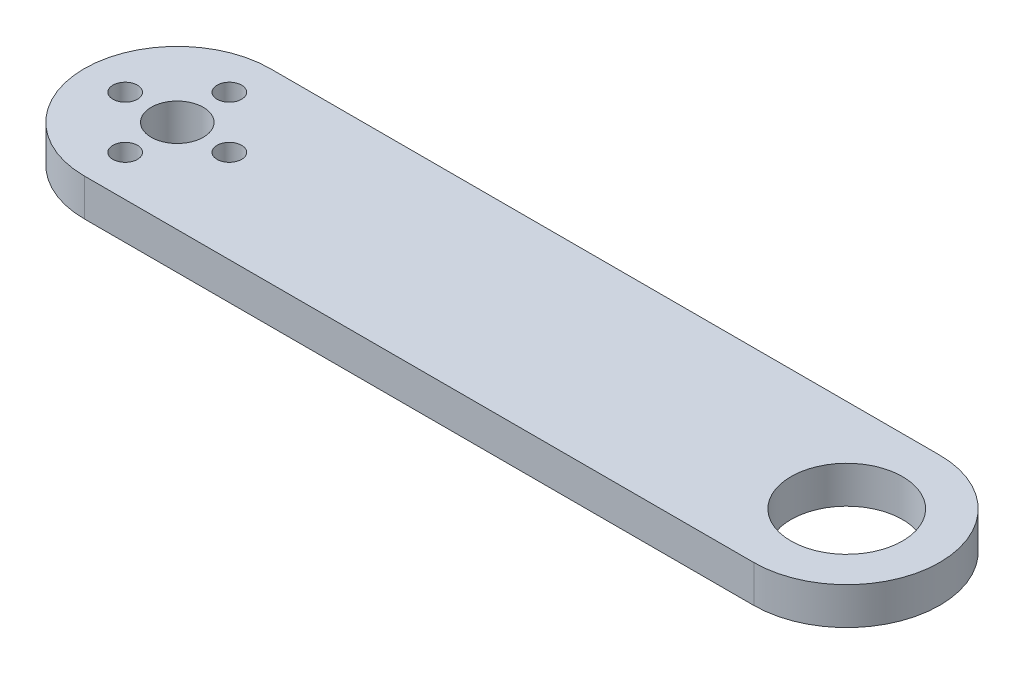
ISO-10303-21;
HEADER;
FILE_DESCRIPTION(('STEP AP214'),'2;1');
FILE_NAME('part.step','',(''),(''),'','','');
FILE_SCHEMA(('AUTOMOTIVE_DESIGN { 1 0 10303 214 1 1 1 1 }'));
ENDSEC;
DATA;
#1=APPLICATION_CONTEXT('core data for automotive mechanical design processes');
#2=APPLICATION_PROTOCOL_DEFINITION('international standard','automotive_design',2000,#1);
#3=PRODUCT_CONTEXT('',#1,'mechanical');
#4=PRODUCT('Part','Part','',(#3));
#5=PRODUCT_RELATED_PRODUCT_CATEGORY('part','',(#4));
#6=PRODUCT_DEFINITION_FORMATION('','',#4);
#7=PRODUCT_DEFINITION_CONTEXT('part definition',#1,'design');
#8=PRODUCT_DEFINITION('design','',#6,#7);
#9=PRODUCT_DEFINITION_SHAPE('','',#8);
#10=(LENGTH_UNIT() NAMED_UNIT(*) SI_UNIT(.MILLI.,.METRE.));
#11=(NAMED_UNIT(*) PLANE_ANGLE_UNIT() SI_UNIT($,.RADIAN.));
#12=(NAMED_UNIT(*) SI_UNIT($,.STERADIAN.) SOLID_ANGLE_UNIT());
#13=UNCERTAINTY_MEASURE_WITH_UNIT(LENGTH_MEASURE(1.E-05),#10,'distance_accuracy_value','');
#14=(GEOMETRIC_REPRESENTATION_CONTEXT(3) GLOBAL_UNCERTAINTY_ASSIGNED_CONTEXT((#13)) GLOBAL_UNIT_ASSIGNED_CONTEXT((#10,
#11,#12)) REPRESENTATION_CONTEXT('',''));
#15=CARTESIAN_POINT('',(0.,0.,0.));
#16=DIRECTION('',(0.,0.,1.));
#17=DIRECTION('',(1.,0.,0.));
#18=AXIS2_PLACEMENT_3D('',#15,#16,#17);
#19=CARTESIAN_POINT('',(45.,5.,0.));
#20=DIRECTION('',(0.,-1.,0.));
#21=DIRECTION('',(0.,0.,-1.));
#22=AXIS2_PLACEMENT_3D('',#19,#20,#21);
#23=CYLINDRICAL_SURFACE('',#22,12.5);
#24=CARTESIAN_POINT('',(45.,0.,0.));
#25=DIRECTION('',(0.,1.,0.));
#26=DIRECTION('',(0.,0.,1.));
#27=AXIS2_PLACEMENT_3D('',#24,#25,#26);
#28=CIRCLE('',#27,12.5);
#29=CARTESIAN_POINT('',(45.,0.,12.5));
#30=VERTEX_POINT('',#29);
#31=CARTESIAN_POINT('',(45.,0.,-12.5));
#32=VERTEX_POINT('',#31);
#33=EDGE_CURVE('E98',#30,#32,#28,.T.);
#34=ORIENTED_EDGE('',*,*,#33,.T.);
#35=DIRECTION('',(0.,-1.,0.));
#36=VECTOR('',#35,1.);
#37=CARTESIAN_POINT('',(45.,5.,-12.5));
#38=LINE('',#37,#36);
#39=CARTESIAN_POINT('',(45.,5.,-12.5));
#40=VERTEX_POINT('',#39);
#41=EDGE_CURVE('E11',#40,#32,#38,.T.);
#42=ORIENTED_EDGE('',*,*,#41,.F.);
#43=CARTESIAN_POINT('',(45.,5.,0.));
#44=DIRECTION('',(0.,1.,0.));
#45=DIRECTION('',(0.,0.,1.));
#46=AXIS2_PLACEMENT_3D('',#43,#44,#45);
#47=CIRCLE('',#46,12.5);
#48=CARTESIAN_POINT('',(45.,5.,12.5));
#49=VERTEX_POINT('',#48);
#50=EDGE_CURVE('E86',#49,#40,#47,.T.);
#51=ORIENTED_EDGE('',*,*,#50,.F.);
#52=DIRECTION('',(0.,-1.,0.));
#53=VECTOR('',#52,1.);
#54=CARTESIAN_POINT('',(45.,5.,12.5));
#55=LINE('',#54,#53);
#56=EDGE_CURVE('E94',#49,#30,#55,.T.);
#57=ORIENTED_EDGE('',*,*,#56,.T.);
#58=EDGE_LOOP('',(#34,#42,#51,#57));
#59=FACE_BOUND('',#58,.T.);
#60=ADVANCED_FACE('F35',(#59),#23,.T.);
#61=CARTESIAN_POINT('',(45.,5.,-12.5));
#62=DIRECTION('',(0.,0.,1.));
#63=DIRECTION('',(1.,0.,0.));
#64=AXIS2_PLACEMENT_3D('',#61,#62,#63);
#65=PLANE('',#64);
#66=DIRECTION('',(-1.,0.,0.));
#67=VECTOR('',#66,1.);
#68=CARTESIAN_POINT('',(45.,0.,-12.5));
#69=LINE('',#68,#67);
#70=CARTESIAN_POINT('',(-45.,0.,-12.5));
#71=VERTEX_POINT('',#70);
#72=EDGE_CURVE('E90',#32,#71,#69,.T.);
#73=ORIENTED_EDGE('',*,*,#72,.T.);
#74=DIRECTION('',(0.,-1.,0.));
#75=VECTOR('',#74,1.);
#76=CARTESIAN_POINT('',(-45.,5.,-12.5));
#77=LINE('',#76,#75);
#78=CARTESIAN_POINT('',(-45.,5.,-12.5));
#79=VERTEX_POINT('',#78);
#80=EDGE_CURVE('E43',#79,#71,#77,.T.);
#81=ORIENTED_EDGE('',*,*,#80,.F.);
#82=DIRECTION('',(-1.,0.,0.));
#83=VECTOR('',#82,1.);
#84=CARTESIAN_POINT('',(45.,5.,-12.5));
#85=LINE('',#84,#83);
#86=EDGE_CURVE('E81',#40,#79,#85,.T.);
#87=ORIENTED_EDGE('',*,*,#86,.F.);
#88=ORIENTED_EDGE('',*,*,#41,.T.);
#89=EDGE_LOOP('',(#73,#81,#87,#88));
#90=FACE_BOUND('',#89,.T.);
#91=ADVANCED_FACE('F89',(#90),#65,.F.);
#92=CARTESIAN_POINT('',(-45.,5.,0.));
#93=DIRECTION('',(0.,-1.,0.));
#94=DIRECTION('',(0.,0.,-1.));
#95=AXIS2_PLACEMENT_3D('',#92,#93,#94);
#96=CYLINDRICAL_SURFACE('',#95,12.5);
#97=CARTESIAN_POINT('',(-45.,0.,0.));
#98=DIRECTION('',(0.,1.,0.));
#99=DIRECTION('',(0.,0.,1.));
#100=AXIS2_PLACEMENT_3D('',#97,#98,#99);
#101=CIRCLE('',#100,12.5);
#102=CARTESIAN_POINT('',(-45.,0.,12.5));
#103=VERTEX_POINT('',#102);
#104=EDGE_CURVE('E68',#71,#103,#101,.T.);
#105=ORIENTED_EDGE('',*,*,#104,.T.);
#106=DIRECTION('',(0.,-1.,0.));
#107=VECTOR('',#106,1.);
#108=CARTESIAN_POINT('',(-45.,5.,12.5));
#109=LINE('',#108,#107);
#110=CARTESIAN_POINT('',(-45.,5.,12.5));
#111=VERTEX_POINT('',#110);
#112=EDGE_CURVE('E91',#111,#103,#109,.T.);
#113=ORIENTED_EDGE('',*,*,#112,.F.);
#114=CARTESIAN_POINT('',(-45.,5.,0.));
#115=DIRECTION('',(0.,1.,0.));
#116=DIRECTION('',(0.,0.,1.));
#117=AXIS2_PLACEMENT_3D('',#114,#115,#116);
#118=CIRCLE('',#117,12.5);
#119=EDGE_CURVE('E84',#79,#111,#118,.T.);
#120=ORIENTED_EDGE('',*,*,#119,.F.);
#121=ORIENTED_EDGE('',*,*,#80,.T.);
#122=EDGE_LOOP('',(#105,#113,#120,#121));
#123=FACE_BOUND('',#122,.T.);
#124=ADVANCED_FACE('F92',(#123),#96,.T.);
#125=CARTESIAN_POINT('',(45.,5.,12.5));
#126=DIRECTION('',(0.,0.,-1.));
#127=DIRECTION('',(-1.,0.,0.));
#128=AXIS2_PLACEMENT_3D('',#125,#126,#127);
#129=PLANE('',#128);
#130=DIRECTION('',(1.,0.,0.));
#131=VECTOR('',#130,1.);
#132=CARTESIAN_POINT('',(45.,0.,12.5));
#133=LINE('',#132,#131);
#134=EDGE_CURVE('E74',#103,#30,#133,.T.);
#135=ORIENTED_EDGE('',*,*,#134,.T.);
#136=ORIENTED_EDGE('',*,*,#56,.F.);
#137=DIRECTION('',(1.,0.,0.));
#138=VECTOR('',#137,1.);
#139=CARTESIAN_POINT('',(45.,5.,12.5));
#140=LINE('',#139,#138);
#141=EDGE_CURVE('E51',#111,#49,#140,.T.);
#142=ORIENTED_EDGE('',*,*,#141,.F.);
#143=ORIENTED_EDGE('',*,*,#112,.T.);
#144=EDGE_LOOP('',(#135,#136,#142,#143));
#145=FACE_BOUND('',#144,.T.);
#146=ADVANCED_FACE('F106',(#145),#129,.F.);
#147=CARTESIAN_POINT('',(45.,5.,0.));
#148=DIRECTION('',(0.,1.,0.));
#149=DIRECTION('',(0.,0.,1.));
#150=AXIS2_PLACEMENT_3D('',#147,#148,#149);
#151=PLANE('',#150);
#152=CARTESIAN_POINT('',(-52.,5.,0.));
#153=DIRECTION('',(0.,1.,0.));
#154=DIRECTION('',(0.,0.,1.));
#155=AXIS2_PLACEMENT_3D('',#152,#153,#154);
#156=CIRCLE('',#155,1.65);
#157=CARTESIAN_POINT('',(-52.,5.,1.65));
#158=VERTEX_POINT('',#157);
#159=EDGE_CURVE('E122',#158,#158,#156,.T.);
#160=ORIENTED_EDGE('',*,*,#159,.F.);
#161=EDGE_LOOP('',(#160));
#162=FACE_BOUND('',#161,.T.);
#163=CARTESIAN_POINT('',(45.,5.,0.));
#164=DIRECTION('',(0.,1.,0.));
#165=DIRECTION('',(0.,0.,1.));
#166=AXIS2_PLACEMENT_3D('',#163,#164,#165);
#167=CIRCLE('',#166,7.5);
#168=CARTESIAN_POINT('',(45.,5.,7.5));
#169=VERTEX_POINT('',#168);
#170=EDGE_CURVE('E128',#169,#169,#167,.T.);
#171=ORIENTED_EDGE('',*,*,#170,.F.);
#172=EDGE_LOOP('',(#171));
#173=FACE_BOUND('',#172,.T.);
#174=CARTESIAN_POINT('',(-45.,5.,-7.));
#175=DIRECTION('',(0.,1.,0.));
#176=DIRECTION('',(0.,0.,1.));
#177=AXIS2_PLACEMENT_3D('',#174,#175,#176);
#178=CIRCLE('',#177,1.65);
#179=CARTESIAN_POINT('',(-45.,5.,-5.35));
#180=VERTEX_POINT('',#179);
#181=EDGE_CURVE('E129',#180,#180,#178,.T.);
#182=ORIENTED_EDGE('',*,*,#181,.F.);
#183=EDGE_LOOP('',(#182));
#184=FACE_BOUND('',#183,.T.);
#185=CARTESIAN_POINT('',(-38.,5.,0.));
#186=DIRECTION('',(0.,1.,0.));
#187=DIRECTION('',(0.,0.,1.));
#188=AXIS2_PLACEMENT_3D('',#185,#186,#187);
#189=CIRCLE('',#188,1.65);
#190=CARTESIAN_POINT('',(-38.,5.,1.65));
#191=VERTEX_POINT('',#190);
#192=EDGE_CURVE('E140',#191,#191,#189,.T.);
#193=ORIENTED_EDGE('',*,*,#192,.F.);
#194=EDGE_LOOP('',(#193));
#195=FACE_BOUND('',#194,.T.);
#196=CARTESIAN_POINT('',(-45.,5.,7.));
#197=DIRECTION('',(0.,1.,0.));
#198=DIRECTION('',(0.,0.,1.));
#199=AXIS2_PLACEMENT_3D('',#196,#197,#198);
#200=CIRCLE('',#199,1.65);
#201=CARTESIAN_POINT('',(-45.,5.,8.65));
#202=VERTEX_POINT('',#201);
#203=EDGE_CURVE('E121',#202,#202,#200,.T.);
#204=ORIENTED_EDGE('',*,*,#203,.F.);
#205=EDGE_LOOP('',(#204));
#206=FACE_BOUND('',#205,.T.);
#207=CARTESIAN_POINT('',(-45.,5.,0.));
#208=DIRECTION('',(0.,1.,0.));
#209=DIRECTION('',(0.,0.,1.));
#210=AXIS2_PLACEMENT_3D('',#207,#208,#209);
#211=CIRCLE('',#210,3.5);
#212=CARTESIAN_POINT('',(-45.,5.,3.5));
#213=VERTEX_POINT('',#212);
#214=EDGE_CURVE('E114',#213,#213,#211,.T.);
#215=ORIENTED_EDGE('',*,*,#214,.F.);
#216=EDGE_LOOP('',(#215));
#217=FACE_BOUND('',#216,.T.);
#218=ORIENTED_EDGE('',*,*,#50,.T.);
#219=ORIENTED_EDGE('',*,*,#86,.T.);
#220=ORIENTED_EDGE('',*,*,#119,.T.);
#221=ORIENTED_EDGE('',*,*,#141,.T.);
#222=EDGE_LOOP('',(#218,#219,#220,#221));
#223=FACE_BOUND('',#222,.T.);
#224=ADVANCED_FACE('F82',(#162,#173,#184,#195,#206,#217,#223),#151,.T.);
#225=CARTESIAN_POINT('',(45.,0.,0.));
#226=DIRECTION('',(0.,1.,0.));
#227=DIRECTION('',(0.,0.,1.));
#228=AXIS2_PLACEMENT_3D('',#225,#226,#227);
#229=PLANE('',#228);
#230=CARTESIAN_POINT('',(-52.,0.,0.));
#231=DIRECTION('',(0.,1.,0.));
#232=DIRECTION('',(0.,0.,1.));
#233=AXIS2_PLACEMENT_3D('',#230,#231,#232);
#234=CIRCLE('',#233,1.65);
#235=CARTESIAN_POINT('',(-52.,0.,1.65));
#236=VERTEX_POINT('',#235);
#237=EDGE_CURVE('E118',#236,#236,#234,.F.);
#238=ORIENTED_EDGE('',*,*,#237,.F.);
#239=EDGE_LOOP('',(#238));
#240=FACE_BOUND('',#239,.T.);
#241=CARTESIAN_POINT('',(45.,0.,0.));
#242=DIRECTION('',(0.,1.,0.));
#243=DIRECTION('',(0.,0.,1.));
#244=AXIS2_PLACEMENT_3D('',#241,#242,#243);
#245=CIRCLE('',#244,7.5);
#246=CARTESIAN_POINT('',(45.,0.,7.5));
#247=VERTEX_POINT('',#246);
#248=EDGE_CURVE('E117',#247,#247,#245,.F.);
#249=ORIENTED_EDGE('',*,*,#248,.F.);
#250=EDGE_LOOP('',(#249));
#251=FACE_BOUND('',#250,.T.);
#252=CARTESIAN_POINT('',(-45.,0.,-7.));
#253=DIRECTION('',(0.,1.,0.));
#254=DIRECTION('',(0.,0.,1.));
#255=AXIS2_PLACEMENT_3D('',#252,#253,#254);
#256=CIRCLE('',#255,1.65);
#257=CARTESIAN_POINT('',(-45.,0.,-5.35));
#258=VERTEX_POINT('',#257);
#259=EDGE_CURVE('E125',#258,#258,#256,.F.);
#260=ORIENTED_EDGE('',*,*,#259,.F.);
#261=EDGE_LOOP('',(#260));
#262=FACE_BOUND('',#261,.T.);
#263=CARTESIAN_POINT('',(-38.,0.,0.));
#264=DIRECTION('',(0.,1.,0.));
#265=DIRECTION('',(0.,0.,1.));
#266=AXIS2_PLACEMENT_3D('',#263,#264,#265);
#267=CIRCLE('',#266,1.65);
#268=CARTESIAN_POINT('',(-38.,0.,1.65));
#269=VERTEX_POINT('',#268);
#270=EDGE_CURVE('E132',#269,#269,#267,.F.);
#271=ORIENTED_EDGE('',*,*,#270,.F.);
#272=EDGE_LOOP('',(#271));
#273=FACE_BOUND('',#272,.T.);
#274=CARTESIAN_POINT('',(-45.,0.,7.));
#275=DIRECTION('',(0.,1.,0.));
#276=DIRECTION('',(0.,0.,1.));
#277=AXIS2_PLACEMENT_3D('',#274,#275,#276);
#278=CIRCLE('',#277,1.65);
#279=CARTESIAN_POINT('',(-45.,0.,8.65));
#280=VERTEX_POINT('',#279);
#281=EDGE_CURVE('E137',#280,#280,#278,.F.);
#282=ORIENTED_EDGE('',*,*,#281,.F.);
#283=EDGE_LOOP('',(#282));
#284=FACE_BOUND('',#283,.T.);
#285=CARTESIAN_POINT('',(-45.,0.,0.));
#286=DIRECTION('',(0.,1.,0.));
#287=DIRECTION('',(0.,0.,1.));
#288=AXIS2_PLACEMENT_3D('',#285,#286,#287);
#289=CIRCLE('',#288,3.5);
#290=CARTESIAN_POINT('',(-45.,0.,3.5));
#291=VERTEX_POINT('',#290);
#292=EDGE_CURVE('E101',#291,#291,#289,.F.);
#293=ORIENTED_EDGE('',*,*,#292,.F.);
#294=EDGE_LOOP('',(#293));
#295=FACE_BOUND('',#294,.T.);
#296=ORIENTED_EDGE('',*,*,#33,.F.);
#297=ORIENTED_EDGE('',*,*,#134,.F.);
#298=ORIENTED_EDGE('',*,*,#104,.F.);
#299=ORIENTED_EDGE('',*,*,#72,.F.);
#300=EDGE_LOOP('',(#296,#297,#298,#299));
#301=FACE_BOUND('',#300,.T.);
#302=ADVANCED_FACE('F109',(#240,#251,#262,#273,#284,#295,#301),#229,.F.);
#303=CARTESIAN_POINT('',(-45.,-0.00100000000000013,0.));
#304=DIRECTION('',(0.,1.,0.));
#305=DIRECTION('',(0.,0.,1.));
#306=AXIS2_PLACEMENT_3D('',#303,#304,#305);
#307=CYLINDRICAL_SURFACE('',#306,3.5);
#308=ORIENTED_EDGE('',*,*,#214,.T.);
#309=EDGE_LOOP('',(#308));
#310=FACE_BOUND('',#309,.T.);
#311=ORIENTED_EDGE('',*,*,#292,.T.);
#312=EDGE_LOOP('',(#311));
#313=FACE_BOUND('',#312,.T.);
#314=ADVANCED_FACE('F159',(#310,#313),#307,.F.);
#315=CARTESIAN_POINT('',(-45.,-0.00100000000000013,7.));
#316=DIRECTION('',(0.,1.,0.));
#317=DIRECTION('',(0.,0.,1.));
#318=AXIS2_PLACEMENT_3D('',#315,#316,#317);
#319=CYLINDRICAL_SURFACE('',#318,1.65);
#320=ORIENTED_EDGE('',*,*,#203,.T.);
#321=EDGE_LOOP('',(#320));
#322=FACE_BOUND('',#321,.T.);
#323=ORIENTED_EDGE('',*,*,#281,.T.);
#324=EDGE_LOOP('',(#323));
#325=FACE_BOUND('',#324,.T.);
#326=ADVANCED_FACE('F162',(#322,#325),#319,.F.);
#327=CARTESIAN_POINT('',(-38.,-0.00100000000000013,0.));
#328=DIRECTION('',(0.,1.,0.));
#329=DIRECTION('',(0.,0.,1.));
#330=AXIS2_PLACEMENT_3D('',#327,#328,#329);
#331=CYLINDRICAL_SURFACE('',#330,1.65);
#332=ORIENTED_EDGE('',*,*,#192,.T.);
#333=EDGE_LOOP('',(#332));
#334=FACE_BOUND('',#333,.T.);
#335=ORIENTED_EDGE('',*,*,#270,.T.);
#336=EDGE_LOOP('',(#335));
#337=FACE_BOUND('',#336,.T.);
#338=ADVANCED_FACE('F148',(#334,#337),#331,.F.);
#339=CARTESIAN_POINT('',(-45.,-0.00100000000000013,-7.));
#340=DIRECTION('',(0.,1.,0.));
#341=DIRECTION('',(0.,0.,1.));
#342=AXIS2_PLACEMENT_3D('',#339,#340,#341);
#343=CYLINDRICAL_SURFACE('',#342,1.65);
#344=ORIENTED_EDGE('',*,*,#181,.T.);
#345=EDGE_LOOP('',(#344));
#346=FACE_BOUND('',#345,.T.);
#347=ORIENTED_EDGE('',*,*,#259,.T.);
#348=EDGE_LOOP('',(#347));
#349=FACE_BOUND('',#348,.T.);
#350=ADVANCED_FACE('F219',(#346,#349),#343,.F.);
#351=CARTESIAN_POINT('',(45.,-0.00100000000000013,0.));
#352=DIRECTION('',(0.,1.,0.));
#353=DIRECTION('',(0.,0.,1.));
#354=AXIS2_PLACEMENT_3D('',#351,#352,#353);
#355=CYLINDRICAL_SURFACE('',#354,7.5);
#356=ORIENTED_EDGE('',*,*,#170,.T.);
#357=EDGE_LOOP('',(#356));
#358=FACE_BOUND('',#357,.T.);
#359=ORIENTED_EDGE('',*,*,#248,.T.);
#360=EDGE_LOOP('',(#359));
#361=FACE_BOUND('',#360,.T.);
#362=ADVANCED_FACE('F228',(#358,#361),#355,.F.);
#363=CARTESIAN_POINT('',(-52.,-0.00100000000000013,0.));
#364=DIRECTION('',(0.,1.,0.));
#365=DIRECTION('',(0.,0.,1.));
#366=AXIS2_PLACEMENT_3D('',#363,#364,#365);
#367=CYLINDRICAL_SURFACE('',#366,1.65);
#368=ORIENTED_EDGE('',*,*,#159,.T.);
#369=EDGE_LOOP('',(#368));
#370=FACE_BOUND('',#369,.T.);
#371=ORIENTED_EDGE('',*,*,#237,.T.);
#372=EDGE_LOOP('',(#371));
#373=FACE_BOUND('',#372,.T.);
#374=ADVANCED_FACE('F238',(#370,#373),#367,.F.);
#375=CLOSED_SHELL('',(#60,#91,#124,#146,#224,#302,#314,#326,#338,#350,#362,#374));
#376=MANIFOLD_SOLID_BREP('B2',#375);
#377=ADVANCED_BREP_SHAPE_REPRESENTATION('',(#18,#376),#14);
#378=SHAPE_DEFINITION_REPRESENTATION(#9,#377);
ENDSEC;
END-ISO-10303-21;
